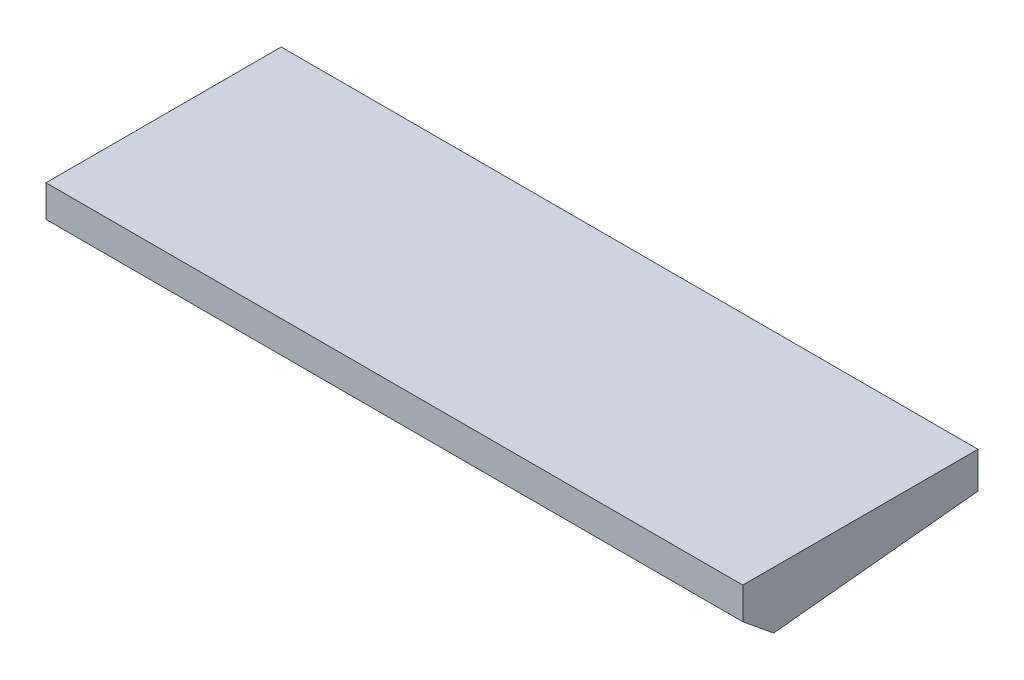
ISO-10303-21;
HEADER;
FILE_DESCRIPTION(('STEP AP214'),'2;1');
FILE_NAME('part.step','',(''),(''),'','','');
FILE_SCHEMA(('AUTOMOTIVE_DESIGN { 1 0 10303 214 1 1 1 1 }'));
ENDSEC;
DATA;
#1=APPLICATION_CONTEXT('core data for automotive mechanical design processes');
#2=APPLICATION_PROTOCOL_DEFINITION('international standard','automotive_design',2000,#1);
#3=PRODUCT_CONTEXT('',#1,'mechanical');
#4=PRODUCT('Part','Part','',(#3));
#5=PRODUCT_RELATED_PRODUCT_CATEGORY('part','',(#4));
#6=PRODUCT_DEFINITION_FORMATION('','',#4);
#7=PRODUCT_DEFINITION_CONTEXT('part definition',#1,'design');
#8=PRODUCT_DEFINITION('design','',#6,#7);
#9=PRODUCT_DEFINITION_SHAPE('','',#8);
#10=(LENGTH_UNIT() NAMED_UNIT(*) SI_UNIT(.MILLI.,.METRE.));
#11=(NAMED_UNIT(*) PLANE_ANGLE_UNIT() SI_UNIT($,.RADIAN.));
#12=(NAMED_UNIT(*) SI_UNIT($,.STERADIAN.) SOLID_ANGLE_UNIT());
#13=UNCERTAINTY_MEASURE_WITH_UNIT(LENGTH_MEASURE(1.E-05),#10,'distance_accuracy_value','');
#14=(GEOMETRIC_REPRESENTATION_CONTEXT(3) GLOBAL_UNCERTAINTY_ASSIGNED_CONTEXT((#13)) GLOBAL_UNIT_ASSIGNED_CONTEXT((#10,
#11,#12)) REPRESENTATION_CONTEXT('',''));
#15=CARTESIAN_POINT('',(0.,0.,0.));
#16=DIRECTION('',(0.,0.,1.));
#17=DIRECTION('',(1.,0.,0.));
#18=AXIS2_PLACEMENT_3D('',#15,#16,#17);
#19=CARTESIAN_POINT('',(390.2,-56.0417627543353,45.7212997059));
#20=DIRECTION('',(0.,0.774844571121076,-0.632151793957904));
#21=DIRECTION('',(0.,0.632151793957904,0.774844571121076));
#22=AXIS2_PLACEMENT_3D('',#19,#20,#21);
#23=PLANE('',#22);
#24=DIRECTION('',(0.,-0.632151793957904,-0.774844571121076));
#25=VECTOR('',#24,1.);
#26=CARTESIAN_POINT('',(0.,-56.0417627543353,45.7212997059));
#27=LINE('',#26,#25);
#28=CARTESIAN_POINT('',(0.,14.1033884912186,131.7));
#29=VERTEX_POINT('',#28);
#30=CARTESIAN_POINT('',(0.,0.,114.413117148));
#31=VERTEX_POINT('',#30);
#32=EDGE_CURVE('E121',#29,#31,#27,.T.);
#33=ORIENTED_EDGE('',*,*,#32,.T.);
#34=DIRECTION('',(-1.,0.,0.));
#35=VECTOR('',#34,1.);
#36=CARTESIAN_POINT('',(390.2,0.,114.413117148));
#37=LINE('',#36,#35);
#38=CARTESIAN_POINT('',(390.2,0.,114.413117148));
#39=VERTEX_POINT('',#38);
#40=EDGE_CURVE('E11',#39,#31,#37,.T.);
#41=ORIENTED_EDGE('',*,*,#40,.F.);
#42=DIRECTION('',(0.,-0.632151793957904,-0.774844571121076));
#43=VECTOR('',#42,1.);
#44=CARTESIAN_POINT('',(390.2,-56.0417627543353,45.7212997059));
#45=LINE('',#44,#43);
#46=CARTESIAN_POINT('',(390.2,14.1033884912186,131.7));
#47=VERTEX_POINT('',#46);
#48=EDGE_CURVE('E136',#47,#39,#45,.T.);
#49=ORIENTED_EDGE('',*,*,#48,.F.);
#50=DIRECTION('',(-1.,0.,0.));
#51=VECTOR('',#50,1.);
#52=CARTESIAN_POINT('',(390.2,14.1033884912186,131.7));
#53=LINE('',#52,#51);
#54=EDGE_CURVE('E58',#47,#29,#53,.T.);
#55=ORIENTED_EDGE('',*,*,#54,.T.);
#56=EDGE_LOOP('',(#33,#41,#49,#55));
#57=FACE_BOUND('',#56,.T.);
#58=ADVANCED_FACE('F41',(#57),#23,.F.);
#59=CARTESIAN_POINT('',(390.2,11.4852588681001,1.16479581966454));
#60=DIRECTION('',(0.,0.994896670852169,0.100899030358423));
#61=DIRECTION('',(0.,-0.100899030358423,0.99489667085217));
#62=AXIS2_PLACEMENT_3D('',#59,#60,#61);
#63=PLANE('',#62);
#64=DIRECTION('',(0.,0.100899030358423,-0.994896670852169));
#65=VECTOR('',#64,1.);
#66=CARTESIAN_POINT('',(0.,11.4852588681001,1.16479581966454));
#67=LINE('',#66,#65);
#68=CARTESIAN_POINT('',(0.,11.6033884912186,0.));
#69=VERTEX_POINT('',#68);
#70=EDGE_CURVE('E124',#31,#69,#67,.T.);
#71=ORIENTED_EDGE('',*,*,#70,.T.);
#72=DIRECTION('',(-1.,0.,0.));
#73=VECTOR('',#72,1.);
#74=CARTESIAN_POINT('',(390.2,11.6033884912186,0.));
#75=LINE('',#74,#73);
#76=CARTESIAN_POINT('',(390.2,11.6033884912186,0.));
#77=VERTEX_POINT('',#76);
#78=EDGE_CURVE('E50',#77,#69,#75,.T.);
#79=ORIENTED_EDGE('',*,*,#78,.F.);
#80=DIRECTION('',(0.,0.100899030358423,-0.994896670852169));
#81=VECTOR('',#80,1.);
#82=CARTESIAN_POINT('',(390.2,11.4852588681001,1.16479581966454));
#83=LINE('',#82,#81);
#84=EDGE_CURVE('E88',#39,#77,#83,.T.);
#85=ORIENTED_EDGE('',*,*,#84,.F.);
#86=ORIENTED_EDGE('',*,*,#40,.T.);
#87=EDGE_LOOP('',(#71,#79,#85,#86));
#88=FACE_BOUND('',#87,.T.);
#89=ADVANCED_FACE('F154',(#88),#63,.F.);
#90=CARTESIAN_POINT('',(390.2,0.,0.));
#91=DIRECTION('',(0.,0.,1.));
#92=DIRECTION('',(0.,-1.,0.));
#93=AXIS2_PLACEMENT_3D('',#90,#91,#92);
#94=PLANE('',#93);
#95=DIRECTION('',(0.,1.,0.));
#96=VECTOR('',#95,1.);
#97=CARTESIAN_POINT('',(0.,0.,0.));
#98=LINE('',#97,#96);
#99=CARTESIAN_POINT('',(0.,31.9033884912186,0.));
#100=VERTEX_POINT('',#99);
#101=EDGE_CURVE('E108',#69,#100,#98,.T.);
#102=ORIENTED_EDGE('',*,*,#101,.T.);
#103=DIRECTION('',(-1.,0.,0.));
#104=VECTOR('',#103,1.);
#105=CARTESIAN_POINT('',(390.2,31.9033884912186,0.));
#106=LINE('',#105,#104);
#107=CARTESIAN_POINT('',(390.2,31.9033884912186,0.));
#108=VERTEX_POINT('',#107);
#109=EDGE_CURVE('E105',#108,#100,#106,.T.);
#110=ORIENTED_EDGE('',*,*,#109,.F.);
#111=DIRECTION('',(0.,1.,0.));
#112=VECTOR('',#111,1.);
#113=CARTESIAN_POINT('',(390.2,0.,0.));
#114=LINE('',#113,#112);
#115=EDGE_CURVE('E94',#77,#108,#114,.T.);
#116=ORIENTED_EDGE('',*,*,#115,.F.);
#117=ORIENTED_EDGE('',*,*,#78,.T.);
#118=EDGE_LOOP('',(#102,#110,#116,#117));
#119=FACE_BOUND('',#118,.T.);
#120=ADVANCED_FACE('F106',(#119),#94,.F.);
#121=CARTESIAN_POINT('',(390.2,31.9033884912186,0.));
#122=DIRECTION('',(0.,-1.,0.));
#123=DIRECTION('',(0.,0.,-1.));
#124=AXIS2_PLACEMENT_3D('',#121,#122,#123);
#125=PLANE('',#124);
#126=DIRECTION('',(0.,0.,1.));
#127=VECTOR('',#126,1.);
#128=CARTESIAN_POINT('',(0.,31.9033884912186,0.));
#129=LINE('',#128,#127);
#130=CARTESIAN_POINT('',(0.,31.9033884912186,131.7));
#131=VERTEX_POINT('',#130);
#132=EDGE_CURVE('E129',#100,#131,#129,.T.);
#133=ORIENTED_EDGE('',*,*,#132,.T.);
#134=DIRECTION('',(-1.,0.,0.));
#135=VECTOR('',#134,1.);
#136=CARTESIAN_POINT('',(390.2,31.9033884912186,131.7));
#137=LINE('',#136,#135);
#138=CARTESIAN_POINT('',(390.2,31.9033884912186,131.7));
#139=VERTEX_POINT('',#138);
#140=EDGE_CURVE('E76',#139,#131,#137,.T.);
#141=ORIENTED_EDGE('',*,*,#140,.F.);
#142=DIRECTION('',(0.,0.,1.));
#143=VECTOR('',#142,1.);
#144=CARTESIAN_POINT('',(390.2,31.9033884912186,0.));
#145=LINE('',#144,#143);
#146=EDGE_CURVE('E99',#108,#139,#145,.T.);
#147=ORIENTED_EDGE('',*,*,#146,.F.);
#148=ORIENTED_EDGE('',*,*,#109,.T.);
#149=EDGE_LOOP('',(#133,#141,#147,#148));
#150=FACE_BOUND('',#149,.T.);
#151=ADVANCED_FACE('F113',(#150),#125,.F.);
#152=CARTESIAN_POINT('',(390.2,0.,131.7));
#153=DIRECTION('',(0.,0.,1.));
#154=DIRECTION('',(1.,0.,0.));
#155=AXIS2_PLACEMENT_3D('',#152,#153,#154);
#156=PLANE('',#155);
#157=DIRECTION('',(0.,1.,0.));
#158=VECTOR('',#157,1.);
#159=CARTESIAN_POINT('',(0.,0.,131.7));
#160=LINE('',#159,#158);
#161=EDGE_CURVE('E132',#29,#131,#160,.T.);
#162=ORIENTED_EDGE('',*,*,#161,.F.);
#163=ORIENTED_EDGE('',*,*,#54,.F.);
#164=DIRECTION('',(0.,1.,0.));
#165=VECTOR('',#164,1.);
#166=CARTESIAN_POINT('',(390.2,0.,131.7));
#167=LINE('',#166,#165);
#168=EDGE_CURVE('E115',#47,#139,#167,.T.);
#169=ORIENTED_EDGE('',*,*,#168,.T.);
#170=ORIENTED_EDGE('',*,*,#140,.T.);
#171=EDGE_LOOP('',(#162,#163,#169,#170));
#172=FACE_BOUND('',#171,.T.);
#173=ADVANCED_FACE('F143',(#172),#156,.T.);
#174=CARTESIAN_POINT('',(390.2,0.,0.));
#175=DIRECTION('',(1.,0.,0.));
#176=DIRECTION('',(0.,0.,-1.));
#177=AXIS2_PLACEMENT_3D('',#174,#175,#176);
#178=PLANE('',#177);
#179=ORIENTED_EDGE('',*,*,#48,.T.);
#180=ORIENTED_EDGE('',*,*,#84,.T.);
#181=ORIENTED_EDGE('',*,*,#115,.T.);
#182=ORIENTED_EDGE('',*,*,#146,.T.);
#183=ORIENTED_EDGE('',*,*,#168,.F.);
#184=EDGE_LOOP('',(#179,#180,#181,#182,#183));
#185=FACE_BOUND('',#184,.T.);
#186=ADVANCED_FACE('F96',(#185),#178,.T.);
#187=CARTESIAN_POINT('',(0.,0.,0.));
#188=DIRECTION('',(1.,0.,0.));
#189=DIRECTION('',(0.,0.,-1.));
#190=AXIS2_PLACEMENT_3D('',#187,#188,#189);
#191=PLANE('',#190);
#192=ORIENTED_EDGE('',*,*,#32,.F.);
#193=ORIENTED_EDGE('',*,*,#161,.T.);
#194=ORIENTED_EDGE('',*,*,#132,.F.);
#195=ORIENTED_EDGE('',*,*,#101,.F.);
#196=ORIENTED_EDGE('',*,*,#70,.F.);
#197=EDGE_LOOP('',(#192,#193,#194,#195,#196));
#198=FACE_BOUND('',#197,.T.);
#199=ADVANCED_FACE('F142',(#198),#191,.F.);
#200=CLOSED_SHELL('',(#58,#89,#120,#151,#173,#186,#199));
#201=MANIFOLD_SOLID_BREP('B2',#200);
#202=ADVANCED_BREP_SHAPE_REPRESENTATION('',(#18,#201),#14);
#203=SHAPE_DEFINITION_REPRESENTATION(#9,#202);
ENDSEC;
END-ISO-10303-21;
